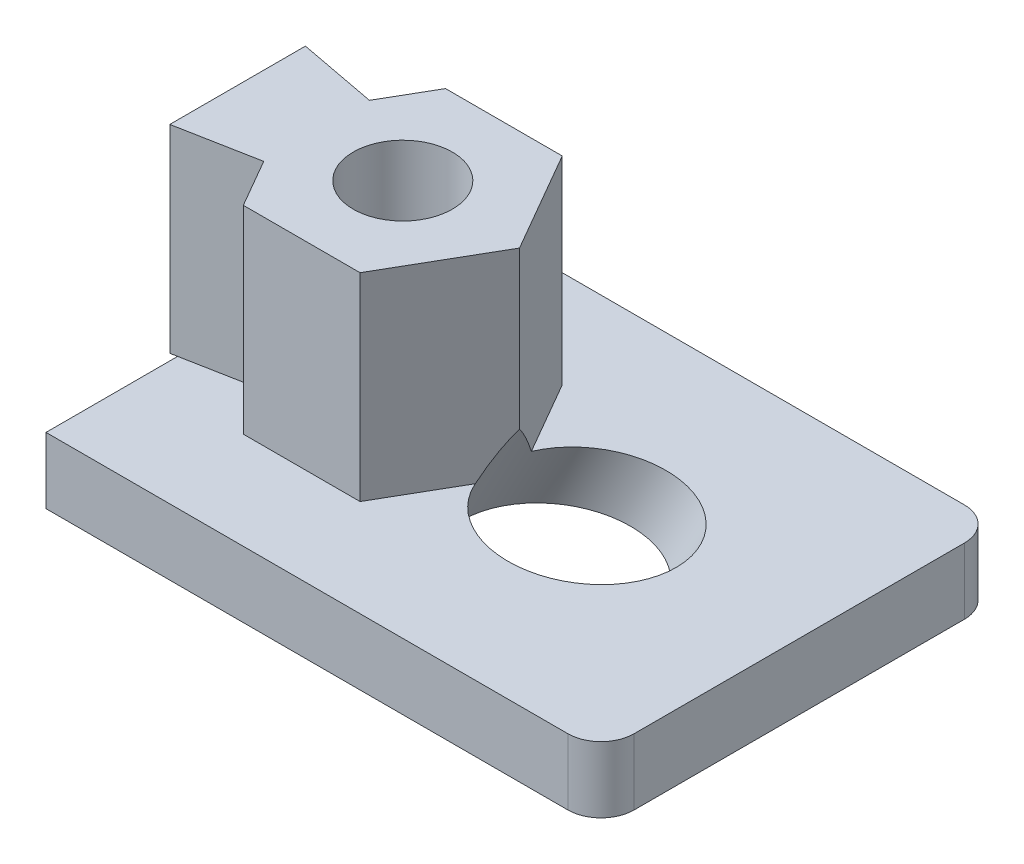
ISO-10303-21;
HEADER;
FILE_DESCRIPTION(('STEP AP214'),'2;1');
FILE_NAME('part.step','',(''),(''),'','','');
FILE_SCHEMA(('AUTOMOTIVE_DESIGN { 1 0 10303 214 1 1 1 1 }'));
ENDSEC;
DATA;
#1=APPLICATION_CONTEXT('core data for automotive mechanical design processes');
#2=APPLICATION_PROTOCOL_DEFINITION('international standard','automotive_design',2000,#1);
#3=PRODUCT_CONTEXT('',#1,'mechanical');
#4=PRODUCT('Part','Part','',(#3));
#5=PRODUCT_RELATED_PRODUCT_CATEGORY('part','',(#4));
#6=PRODUCT_DEFINITION_FORMATION('','',#4);
#7=PRODUCT_DEFINITION_CONTEXT('part definition',#1,'design');
#8=PRODUCT_DEFINITION('design','',#6,#7);
#9=PRODUCT_DEFINITION_SHAPE('','',#8);
#10=(LENGTH_UNIT() NAMED_UNIT(*) SI_UNIT(.MILLI.,.METRE.));
#11=(NAMED_UNIT(*) PLANE_ANGLE_UNIT() SI_UNIT($,.RADIAN.));
#12=(NAMED_UNIT(*) SI_UNIT($,.STERADIAN.) SOLID_ANGLE_UNIT());
#13=UNCERTAINTY_MEASURE_WITH_UNIT(LENGTH_MEASURE(1.E-05),#10,'distance_accuracy_value','');
#14=(GEOMETRIC_REPRESENTATION_CONTEXT(3) GLOBAL_UNCERTAINTY_ASSIGNED_CONTEXT((#13)) GLOBAL_UNIT_ASSIGNED_CONTEXT((#10,
#11,#12)) REPRESENTATION_CONTEXT('',''));
#15=CARTESIAN_POINT('',(0.,0.,0.));
#16=DIRECTION('',(0.,0.,1.));
#17=DIRECTION('',(1.,0.,0.));
#18=AXIS2_PLACEMENT_3D('',#15,#16,#17);
#19=CARTESIAN_POINT('',(0.,7.75,0.));
#20=DIRECTION('',(0.,1.,0.));
#21=DIRECTION('',(0.,0.,1.));
#22=AXIS2_PLACEMENT_3D('',#19,#20,#21);
#23=PLANE('',#22);
#24=DIRECTION('',(0.,0.,-1.));
#25=VECTOR('',#24,1.);
#26=CARTESIAN_POINT('',(1.3,7.75,1.50000000000229));
#27=LINE('',#26,#25);
#28=CARTESIAN_POINT('',(1.3,7.75,0.503733800944792));
#29=VERTEX_POINT('',#28);
#30=CARTESIAN_POINT('',(1.3,7.75,-0.503733800944791));
#31=VERTEX_POINT('',#30);
#32=EDGE_CURVE('E209',#29,#31,#27,.T.);
#33=ORIENTED_EDGE('',*,*,#32,.F.);
#34=DIRECTION('',(0.982526008207233,0.,-0.186125342703135));
#35=VECTOR('',#34,1.);
#36=CARTESIAN_POINT('',(1.84759419581572,7.75,0.400000000000002));
#37=LINE('',#36,#35);
#38=CARTESIAN_POINT('',(1.25,7.75,0.513205577831531));
#39=VERTEX_POINT('',#38);
#40=EDGE_CURVE('E290',#39,#29,#37,.T.);
#41=ORIENTED_EDGE('',*,*,#40,.F.);
#42=DIRECTION('',(0.,0.,1.));
#43=VECTOR('',#42,1.);
#44=CARTESIAN_POINT('',(1.25,7.75,0.513205577831531));
#45=LINE('',#44,#43);
#46=CARTESIAN_POINT('',(1.25,7.75,-0.51320557783153));
#47=VERTEX_POINT('',#46);
#48=EDGE_CURVE('E287',#47,#39,#45,.T.);
#49=ORIENTED_EDGE('',*,*,#48,.F.);
#50=DIRECTION('',(-0.982526008207232,0.,-0.18612534270314));
#51=VECTOR('',#50,1.);
#52=CARTESIAN_POINT('',(1.25,7.75,-0.51320557783153));
#53=LINE('',#52,#51);
#54=EDGE_CURVE('E284',#31,#47,#53,.T.);
#55=ORIENTED_EDGE('',*,*,#54,.F.);
#56=EDGE_LOOP('',(#33,#41,#49,#55));
#57=FACE_BOUND('',#56,.T.);
#58=ADVANCED_FACE('F33',(#57),#23,.F.);
#59=CARTESIAN_POINT('',(0.,9.25,0.));
#60=DIRECTION('',(0.,1.,0.));
#61=DIRECTION('',(0.,0.,1.));
#62=AXIS2_PLACEMENT_3D('',#59,#60,#61);
#63=PLANE('',#62);
#64=DIRECTION('',(-1.,0.,0.));
#65=VECTOR('',#64,1.);
#66=CARTESIAN_POINT('',(2.05832704406993,9.25,-0.765));
#67=LINE('',#66,#65);
#68=CARTESIAN_POINT('',(2.94167295593006,9.25,-0.764999999999997));
#69=VERTEX_POINT('',#68);
#70=CARTESIAN_POINT('',(2.05832704406993,9.25,-0.765));
#71=VERTEX_POINT('',#70);
#72=EDGE_CURVE('E175',#69,#71,#67,.T.);
#73=ORIENTED_EDGE('',*,*,#72,.T.);
#74=DIRECTION('',(-0.499999999999987,0.,0.866025403784446));
#75=VECTOR('',#74,1.);
#76=CARTESIAN_POINT('',(1.84759419581573,9.25,-0.399999999999997));
#77=LINE('',#76,#75);
#78=CARTESIAN_POINT('',(1.84759419581573,9.25,-0.399999999999997));
#79=VERTEX_POINT('',#78);
#80=EDGE_CURVE('E179',#71,#79,#77,.T.);
#81=ORIENTED_EDGE('',*,*,#80,.T.);
#82=DIRECTION('',(-0.982526008207232,0.,-0.18612534270314));
#83=VECTOR('',#82,1.);
#84=CARTESIAN_POINT('',(1.25,9.25,-0.51320557783153));
#85=LINE('',#84,#83);
#86=CARTESIAN_POINT('',(1.25,9.25,-0.51320557783153));
#87=VERTEX_POINT('',#86);
#88=EDGE_CURVE('E268',#79,#87,#85,.T.);
#89=ORIENTED_EDGE('',*,*,#88,.T.);
#90=DIRECTION('',(0.,0.,1.));
#91=VECTOR('',#90,1.);
#92=CARTESIAN_POINT('',(1.25,9.25,0.513205577831531));
#93=LINE('',#92,#91);
#94=CARTESIAN_POINT('',(1.25,9.25,0.513205577831531));
#95=VERTEX_POINT('',#94);
#96=EDGE_CURVE('E270',#87,#95,#93,.T.);
#97=ORIENTED_EDGE('',*,*,#96,.T.);
#98=DIRECTION('',(0.982526008207233,0.,-0.186125342703135));
#99=VECTOR('',#98,1.);
#100=CARTESIAN_POINT('',(1.84759419581572,9.25,0.400000000000002));
#101=LINE('',#100,#99);
#102=CARTESIAN_POINT('',(1.84759419581572,9.25,0.400000000000002));
#103=VERTEX_POINT('',#102);
#104=EDGE_CURVE('E272',#95,#103,#101,.T.);
#105=ORIENTED_EDGE('',*,*,#104,.T.);
#106=DIRECTION('',(0.500000000000006,0.,0.866025403784435));
#107=VECTOR('',#106,1.);
#108=CARTESIAN_POINT('',(2.05832704406993,9.25,0.765));
#109=LINE('',#108,#107);
#110=CARTESIAN_POINT('',(2.05832704406993,9.25,0.765));
#111=VERTEX_POINT('',#110);
#112=EDGE_CURVE('E274',#103,#111,#109,.T.);
#113=ORIENTED_EDGE('',*,*,#112,.T.);
#114=DIRECTION('',(1.,0.,0.));
#115=VECTOR('',#114,1.);
#116=CARTESIAN_POINT('',(2.94167295593006,9.25,0.765000000000002));
#117=LINE('',#116,#115);
#118=CARTESIAN_POINT('',(2.94167295593006,9.25,0.765000000000002));
#119=VERTEX_POINT('',#118);
#120=EDGE_CURVE('E276',#111,#119,#117,.T.);
#121=ORIENTED_EDGE('',*,*,#120,.T.);
#122=DIRECTION('',(0.500000000000003,0.,-0.866025403784437));
#123=VECTOR('',#122,1.);
#124=CARTESIAN_POINT('',(3.38334591186013,9.25,0.));
#125=LINE('',#124,#123);
#126=CARTESIAN_POINT('',(3.38334591186013,9.25,0.));
#127=VERTEX_POINT('',#126);
#128=EDGE_CURVE('E278',#119,#127,#125,.T.);
#129=ORIENTED_EDGE('',*,*,#128,.T.);
#130=DIRECTION('',(-0.500000000000005,0.,-0.866025403784436));
#131=VECTOR('',#130,1.);
#132=CARTESIAN_POINT('',(2.94167295593006,9.25,-0.764999999999997));
#133=LINE('',#132,#131);
#134=EDGE_CURVE('E187',#127,#69,#133,.T.);
#135=ORIENTED_EDGE('',*,*,#134,.T.);
#136=EDGE_LOOP('',(#73,#81,#89,#97,#105,#113,#121,#129,#135));
#137=FACE_BOUND('',#136,.T.);
#138=CARTESIAN_POINT('',(2.50000000000001,9.25,0.));
#139=DIRECTION('',(0.,1.,0.));
#140=DIRECTION('',(-1.,0.,0.));
#141=AXIS2_PLACEMENT_3D('',#138,#139,#140);
#142=CIRCLE('',#141,0.374999999999999);
#143=CARTESIAN_POINT('',(2.12500000000001,9.25,0.));
#144=VERTEX_POINT('',#143);
#145=EDGE_CURVE('E262',#144,#144,#142,.T.);
#146=ORIENTED_EDGE('',*,*,#145,.F.);
#147=EDGE_LOOP('',(#146));
#148=FACE_BOUND('',#147,.T.);
#149=ADVANCED_FACE('F305',(#137,#148),#63,.T.);
#150=CARTESIAN_POINT('',(2.05832704406993,9.25,-0.765));
#151=DIRECTION('',(0.,0.,1.));
#152=DIRECTION('',(1.,0.,0.));
#153=AXIS2_PLACEMENT_3D('',#150,#151,#152);
#154=PLANE('',#153);
#155=DIRECTION('',(-1.,0.,0.));
#156=VECTOR('',#155,1.);
#157=CARTESIAN_POINT('',(2.05832704406993,7.75,-0.765));
#158=LINE('',#157,#156);
#159=CARTESIAN_POINT('',(2.94167295593006,7.75,-0.764999999999997));
#160=VERTEX_POINT('',#159);
#161=CARTESIAN_POINT('',(2.05832704406993,7.75,-0.765));
#162=VERTEX_POINT('',#161);
#163=EDGE_CURVE('E174',#160,#162,#158,.T.);
#164=ORIENTED_EDGE('',*,*,#163,.T.);
#165=DIRECTION('',(0.,-1.,0.));
#166=VECTOR('',#165,1.);
#167=CARTESIAN_POINT('',(2.05832704406993,9.25,-0.765));
#168=LINE('',#167,#166);
#169=EDGE_CURVE('E207',#71,#162,#168,.T.);
#170=ORIENTED_EDGE('',*,*,#169,.F.);
#171=ORIENTED_EDGE('',*,*,#72,.F.);
#172=DIRECTION('',(0.,-1.,0.));
#173=VECTOR('',#172,1.);
#174=CARTESIAN_POINT('',(2.94167295593006,9.25,-0.764999999999997));
#175=LINE('',#174,#173);
#176=EDGE_CURVE('E185',#69,#160,#175,.T.);
#177=ORIENTED_EDGE('',*,*,#176,.T.);
#178=EDGE_LOOP('',(#164,#170,#171,#177));
#179=FACE_BOUND('',#178,.T.);
#180=ADVANCED_FACE('F359',(#179),#154,.F.);
#181=CARTESIAN_POINT('',(1.84759419581573,9.25,-0.399999999999997));
#182=DIRECTION('',(0.866025403784446,0.,0.499999999999987));
#183=DIRECTION('',(0.499999999999987,0.,-0.866025403784446));
#184=AXIS2_PLACEMENT_3D('',#181,#182,#183);
#185=PLANE('',#184);
#186=DIRECTION('',(-0.499999999999987,0.,0.866025403784446));
#187=VECTOR('',#186,1.);
#188=CARTESIAN_POINT('',(1.84759419581573,7.75,-0.399999999999997));
#189=LINE('',#188,#187);
#190=CARTESIAN_POINT('',(1.84759419581573,7.75,-0.399999999999997));
#191=VERTEX_POINT('',#190);
#192=EDGE_CURVE('E282',#162,#191,#189,.T.);
#193=ORIENTED_EDGE('',*,*,#192,.T.);
#194=DIRECTION('',(0.,-1.,0.));
#195=VECTOR('',#194,1.);
#196=CARTESIAN_POINT('',(1.84759419581573,9.25,-0.399999999999997));
#197=LINE('',#196,#195);
#198=EDGE_CURVE('E204',#79,#191,#197,.T.);
#199=ORIENTED_EDGE('',*,*,#198,.F.);
#200=ORIENTED_EDGE('',*,*,#80,.F.);
#201=ORIENTED_EDGE('',*,*,#169,.T.);
#202=EDGE_LOOP('',(#193,#199,#200,#201));
#203=FACE_BOUND('',#202,.T.);
#204=ADVANCED_FACE('F481',(#203),#185,.F.);
#205=CARTESIAN_POINT('',(1.25,9.25,-0.51320557783153));
#206=DIRECTION('',(-0.18612534270314,0.,0.982526008207232));
#207=DIRECTION('',(0.982526008207233,0.,0.18612534270314));
#208=AXIS2_PLACEMENT_3D('',#205,#206,#207);
#209=PLANE('',#208);
#210=EDGE_CURVE('E285',#191,#31,#53,.T.);
#211=ORIENTED_EDGE('',*,*,#210,.T.);
#212=ORIENTED_EDGE('',*,*,#54,.T.);
#213=DIRECTION('',(0.,-1.,0.));
#214=VECTOR('',#213,1.);
#215=CARTESIAN_POINT('',(1.25,9.25,-0.51320557783153));
#216=LINE('',#215,#214);
#217=EDGE_CURVE('E201',#87,#47,#216,.T.);
#218=ORIENTED_EDGE('',*,*,#217,.F.);
#219=ORIENTED_EDGE('',*,*,#88,.F.);
#220=ORIENTED_EDGE('',*,*,#198,.T.);
#221=EDGE_LOOP('',(#211,#212,#218,#219,#220));
#222=FACE_BOUND('',#221,.T.);
#223=ADVANCED_FACE('F334',(#222),#209,.F.);
#224=CARTESIAN_POINT('',(1.25,9.25,0.513205577831531));
#225=DIRECTION('',(1.,0.,0.));
#226=DIRECTION('',(0.,0.,-1.));
#227=AXIS2_PLACEMENT_3D('',#224,#225,#226);
#228=PLANE('',#227);
#229=ORIENTED_EDGE('',*,*,#48,.T.);
#230=DIRECTION('',(0.,-1.,0.));
#231=VECTOR('',#230,1.);
#232=CARTESIAN_POINT('',(1.25,9.25,0.513205577831531));
#233=LINE('',#232,#231);
#234=EDGE_CURVE('E198',#95,#39,#233,.T.);
#235=ORIENTED_EDGE('',*,*,#234,.F.);
#236=ORIENTED_EDGE('',*,*,#96,.F.);
#237=ORIENTED_EDGE('',*,*,#217,.T.);
#238=EDGE_LOOP('',(#229,#235,#236,#237));
#239=FACE_BOUND('',#238,.T.);
#240=ADVANCED_FACE('F343',(#239),#228,.F.);
#241=CARTESIAN_POINT('',(1.84759419581572,9.25,0.400000000000002));
#242=DIRECTION('',(-0.186125342703135,0.,-0.982526008207233));
#243=DIRECTION('',(-0.982526008207234,0.,0.186125342703135));
#244=AXIS2_PLACEMENT_3D('',#241,#242,#243);
#245=PLANE('',#244);
#246=ORIENTED_EDGE('',*,*,#40,.T.);
#247=CARTESIAN_POINT('',(1.84759419581572,7.75,0.400000000000002));
#248=VERTEX_POINT('',#247);
#249=EDGE_CURVE('E289',#29,#248,#37,.T.);
#250=ORIENTED_EDGE('',*,*,#249,.T.);
#251=DIRECTION('',(0.,-1.,0.));
#252=VECTOR('',#251,1.);
#253=CARTESIAN_POINT('',(1.84759419581572,9.25,0.400000000000002));
#254=LINE('',#253,#252);
#255=EDGE_CURVE('E195',#103,#248,#254,.T.);
#256=ORIENTED_EDGE('',*,*,#255,.F.);
#257=ORIENTED_EDGE('',*,*,#104,.F.);
#258=ORIENTED_EDGE('',*,*,#234,.T.);
#259=EDGE_LOOP('',(#246,#250,#256,#257,#258));
#260=FACE_BOUND('',#259,.T.);
#261=ADVANCED_FACE('F345',(#260),#245,.F.);
#262=CARTESIAN_POINT('',(2.05832704406993,9.25,0.765));
#263=DIRECTION('',(0.866025403784435,0.,-0.500000000000006));
#264=DIRECTION('',(-0.500000000000006,0.,-0.866025403784435));
#265=AXIS2_PLACEMENT_3D('',#262,#263,#264);
#266=PLANE('',#265);
#267=DIRECTION('',(0.500000000000006,0.,0.866025403784435));
#268=VECTOR('',#267,1.);
#269=CARTESIAN_POINT('',(2.05832704406993,7.75,0.765));
#270=LINE('',#269,#268);
#271=CARTESIAN_POINT('',(2.05832704406993,7.75,0.765));
#272=VERTEX_POINT('',#271);
#273=EDGE_CURVE('E293',#248,#272,#270,.T.);
#274=ORIENTED_EDGE('',*,*,#273,.T.);
#275=DIRECTION('',(0.,-1.,0.));
#276=VECTOR('',#275,1.);
#277=CARTESIAN_POINT('',(2.05832704406993,9.25,0.765));
#278=LINE('',#277,#276);
#279=EDGE_CURVE('E192',#111,#272,#278,.T.);
#280=ORIENTED_EDGE('',*,*,#279,.F.);
#281=ORIENTED_EDGE('',*,*,#112,.F.);
#282=ORIENTED_EDGE('',*,*,#255,.T.);
#283=EDGE_LOOP('',(#274,#280,#281,#282));
#284=FACE_BOUND('',#283,.T.);
#285=ADVANCED_FACE('F311',(#284),#266,.F.);
#286=CARTESIAN_POINT('',(2.94167295593006,9.25,0.765000000000002));
#287=DIRECTION('',(0.,0.,-1.));
#288=DIRECTION('',(-1.,0.,0.));
#289=AXIS2_PLACEMENT_3D('',#286,#287,#288);
#290=PLANE('',#289);
#291=DIRECTION('',(1.,0.,0.));
#292=VECTOR('',#291,1.);
#293=CARTESIAN_POINT('',(2.94167295593006,7.75,0.765000000000002));
#294=LINE('',#293,#292);
#295=CARTESIAN_POINT('',(2.94167295593006,7.75,0.765000000000002));
#296=VERTEX_POINT('',#295);
#297=EDGE_CURVE('E181',#272,#296,#294,.T.);
#298=ORIENTED_EDGE('',*,*,#297,.T.);
#299=DIRECTION('',(0.,-1.,0.));
#300=VECTOR('',#299,1.);
#301=CARTESIAN_POINT('',(2.94167295593006,9.25,0.765000000000002));
#302=LINE('',#301,#300);
#303=EDGE_CURVE('E189',#119,#296,#302,.T.);
#304=ORIENTED_EDGE('',*,*,#303,.F.);
#305=ORIENTED_EDGE('',*,*,#120,.F.);
#306=ORIENTED_EDGE('',*,*,#279,.T.);
#307=EDGE_LOOP('',(#298,#304,#305,#306));
#308=FACE_BOUND('',#307,.T.);
#309=ADVANCED_FACE('F297',(#308),#290,.F.);
#310=CARTESIAN_POINT('',(3.38334591186013,9.25,0.));
#311=DIRECTION('',(-0.866025403784437,0.,-0.500000000000003));
#312=DIRECTION('',(-0.500000000000003,0.,0.866025403784437));
#313=AXIS2_PLACEMENT_3D('',#310,#311,#312);
#314=PLANE('',#313);
#315=DIRECTION('',(0.500000000000003,0.,-0.866025403784437));
#316=VECTOR('',#315,1.);
#317=CARTESIAN_POINT('',(3.38334591186013,7.75,0.));
#318=LINE('',#317,#316);
#319=CARTESIAN_POINT('',(3.26095014904517,7.75,0.211995679826664));
#320=VERTEX_POINT('',#319);
#321=EDGE_CURVE('E176',#296,#320,#318,.T.);
#322=ORIENTED_EDGE('',*,*,#321,.T.);
#323=CARTESIAN_POINT('',(3.38334591189427,6.79377358483847,-5.91256302810969E-11));
#324=DIRECTION('',(-0.866025403784437,0.,-0.500000000000003));
#325=DIRECTION('',(0.128831325280167,0.966234939601246,-0.223142400991681));
#326=AXIS2_PLACEMENT_3D('',#323,#324,#325);
#327=ELLIPSE('',#326,1.46463659655629,0.596899999967116);
#328=CARTESIAN_POINT('',(3.38334591186013,8.06218608470459,0.));
#329=VERTEX_POINT('',#328);
#330=EDGE_CURVE('E49',#320,#329,#327,.T.);
#331=ORIENTED_EDGE('',*,*,#330,.T.);
#332=DIRECTION('',(0.,-1.,0.));
#333=VECTOR('',#332,1.);
#334=CARTESIAN_POINT('',(3.38334591186013,9.25,0.));
#335=LINE('',#334,#333);
#336=EDGE_CURVE('E168',#127,#329,#335,.T.);
#337=ORIENTED_EDGE('',*,*,#336,.F.);
#338=ORIENTED_EDGE('',*,*,#128,.F.);
#339=ORIENTED_EDGE('',*,*,#303,.T.);
#340=EDGE_LOOP('',(#322,#331,#337,#338,#339));
#341=FACE_BOUND('',#340,.T.);
#342=ADVANCED_FACE('F303',(#341),#314,.F.);
#343=CARTESIAN_POINT('',(2.94167295593006,9.25,-0.764999999999997));
#344=DIRECTION('',(-0.866025403784436,0.,0.500000000000005));
#345=DIRECTION('',(0.500000000000005,0.,0.866025403784436));
#346=AXIS2_PLACEMENT_3D('',#343,#344,#345);
#347=PLANE('',#346);
#348=ORIENTED_EDGE('',*,*,#336,.T.);
#349=CARTESIAN_POINT('',(3.38334591182599,6.79377358471046,-5.91256302810969E-11));
#350=DIRECTION('',(-0.866025403784436,0.,0.500000000000005));
#351=DIRECTION('',(0.128831325280168,0.966234939601246,0.223142400991681));
#352=AXIS2_PLACEMENT_3D('',#349,#350,#351);
#353=ELLIPSE('',#352,1.46463659655629,0.596899999967116);
#354=CARTESIAN_POINT('',(3.260950149016,7.75,-0.211995679877181));
#355=VERTEX_POINT('',#354);
#356=EDGE_CURVE('E154',#329,#355,#353,.T.);
#357=ORIENTED_EDGE('',*,*,#356,.T.);
#358=DIRECTION('',(-0.500000000000005,0.,-0.866025403784436));
#359=VECTOR('',#358,1.);
#360=CARTESIAN_POINT('',(2.94167295593006,7.75,-0.764999999999997));
#361=LINE('',#360,#359);
#362=EDGE_CURVE('E164',#355,#160,#361,.T.);
#363=ORIENTED_EDGE('',*,*,#362,.T.);
#364=ORIENTED_EDGE('',*,*,#176,.F.);
#365=ORIENTED_EDGE('',*,*,#134,.F.);
#366=EDGE_LOOP('',(#348,#357,#363,#364,#365));
#367=FACE_BOUND('',#366,.T.);
#368=ADVANCED_FACE('F162',(#367),#347,.F.);
#369=CARTESIAN_POINT('',(2.50000000000001,9.25,0.));
#370=DIRECTION('',(0.,-1.,0.));
#371=DIRECTION('',(1.,0.,0.));
#372=AXIS2_PLACEMENT_3D('',#369,#370,#371);
#373=CYLINDRICAL_SURFACE('',#372,0.374999999999999);
#374=ORIENTED_EDGE('',*,*,#145,.T.);
#375=EDGE_LOOP('',(#374));
#376=FACE_BOUND('',#375,.T.);
#377=CARTESIAN_POINT('',(2.50000000000001,7.75,0.));
#378=DIRECTION('',(0.,1.,0.));
#379=DIRECTION('',(-1.,0.,0.));
#380=AXIS2_PLACEMENT_3D('',#377,#378,#379);
#381=CIRCLE('',#380,0.374999999999999);
#382=CARTESIAN_POINT('',(2.12500000000001,7.75,0.));
#383=VERTEX_POINT('',#382);
#384=EDGE_CURVE('E261',#383,#383,#381,.T.);
#385=ORIENTED_EDGE('',*,*,#384,.F.);
#386=EDGE_LOOP('',(#385));
#387=FACE_BOUND('',#386,.T.);
#388=ADVANCED_FACE('F365',(#376,#387),#373,.F.);
#389=CARTESIAN_POINT('',(0.,7.75,0.));
#390=DIRECTION('',(0.,-1.,0.));
#391=DIRECTION('',(1.,0.,0.));
#392=AXIS2_PLACEMENT_3D('',#389,#390,#391);
#393=PLANE('',#392);
#394=ORIENTED_EDGE('',*,*,#362,.F.);
#395=CARTESIAN_POINT('',(3.89333333331375,7.75,-5.91256302810969E-11));
#396=DIRECTION('',(0.,-1.,0.));
#397=DIRECTION('',(1.,0.,0.));
#398=AXIS2_PLACEMENT_3D('',#395,#396,#397);
#399=ELLIPSE('',#398,0.676486666629397,0.596899999967116);
#400=EDGE_CURVE('E151',#355,#320,#399,.T.);
#401=ORIENTED_EDGE('',*,*,#400,.T.);
#402=ORIENTED_EDGE('',*,*,#321,.F.);
#403=ORIENTED_EDGE('',*,*,#297,.F.);
#404=ORIENTED_EDGE('',*,*,#273,.F.);
#405=ORIENTED_EDGE('',*,*,#249,.F.);
#406=CARTESIAN_POINT('',(1.3,7.75,1.50000000000229));
#407=VERTEX_POINT('',#406);
#408=EDGE_CURVE('E250',#407,#29,#27,.T.);
#409=ORIENTED_EDGE('',*,*,#408,.F.);
#410=DIRECTION('',(-1.,0.,0.));
#411=VECTOR('',#410,1.);
#412=CARTESIAN_POINT('',(5.49999999994378,7.75,1.50000000000229));
#413=LINE('',#412,#411);
#414=CARTESIAN_POINT('',(5.24999999994378,7.75,1.50000000000229));
#415=VERTEX_POINT('',#414);
#416=EDGE_CURVE('E325',#415,#407,#413,.T.);
#417=ORIENTED_EDGE('',*,*,#416,.F.);
#418=CARTESIAN_POINT('',(5.24999999994378,7.75,1.25000000000229));
#419=DIRECTION('',(0.,-1.,0.));
#420=DIRECTION('',(1.,0.,0.));
#421=AXIS2_PLACEMENT_3D('',#418,#419,#420);
#422=CIRCLE('',#421,0.25);
#423=CARTESIAN_POINT('',(5.49999999994378,7.75,1.25000000000229));
#424=VERTEX_POINT('',#423);
#425=EDGE_CURVE('E215',#415,#424,#422,.F.);
#426=ORIENTED_EDGE('',*,*,#425,.T.);
#427=DIRECTION('',(0.,0.,1.));
#428=VECTOR('',#427,1.);
#429=CARTESIAN_POINT('',(5.49999999994378,7.75,1.50000000000229));
#430=LINE('',#429,#428);
#431=CARTESIAN_POINT('',(5.49999999994378,7.75,-1.24999999999549));
#432=VERTEX_POINT('',#431);
#433=EDGE_CURVE('E244',#432,#424,#430,.T.);
#434=ORIENTED_EDGE('',*,*,#433,.F.);
#435=CARTESIAN_POINT('',(5.24999999994378,7.75,-1.24999999999549));
#436=DIRECTION('',(0.,-1.,0.));
#437=DIRECTION('',(1.,0.,0.));
#438=AXIS2_PLACEMENT_3D('',#435,#436,#437);
#439=CIRCLE('',#438,0.25);
#440=CARTESIAN_POINT('',(5.24999999994378,7.75,-1.49999999999549));
#441=VERTEX_POINT('',#440);
#442=EDGE_CURVE('E217',#432,#441,#439,.F.);
#443=ORIENTED_EDGE('',*,*,#442,.T.);
#444=DIRECTION('',(1.,0.,0.));
#445=VECTOR('',#444,1.);
#446=CARTESIAN_POINT('',(1.3,7.75,-1.49999999999549));
#447=LINE('',#446,#445);
#448=CARTESIAN_POINT('',(1.3,7.75,-1.49999999999549));
#449=VERTEX_POINT('',#448);
#450=EDGE_CURVE('E238',#449,#441,#447,.T.);
#451=ORIENTED_EDGE('',*,*,#450,.F.);
#452=EDGE_CURVE('E253',#31,#449,#27,.T.);
#453=ORIENTED_EDGE('',*,*,#452,.F.);
#454=ORIENTED_EDGE('',*,*,#210,.F.);
#455=ORIENTED_EDGE('',*,*,#192,.F.);
#456=ORIENTED_EDGE('',*,*,#163,.F.);
#457=EDGE_LOOP('',(#394,#401,#402,#403,#404,#405,#409,#417,#426,#434,#443,#451,#453,#454,#455,#456));
#458=FACE_BOUND('',#457,.T.);
#459=ADVANCED_FACE('F171',(#458),#393,.F.);
#460=CARTESIAN_POINT('',(0.,7.25,0.));
#461=DIRECTION('',(0.,-1.,0.));
#462=DIRECTION('',(1.,0.,0.));
#463=AXIS2_PLACEMENT_3D('',#460,#461,#462);
#464=PLANE('',#463);
#465=CARTESIAN_POINT('',(3.62666666664708,7.25,-5.91256302810969E-11));
#466=DIRECTION('',(0.,-1.,0.));
#467=DIRECTION('',(1.,0.,0.));
#468=AXIS2_PLACEMENT_3D('',#465,#466,#467);
#469=ELLIPSE('',#468,0.676486666629397,0.596899999967116);
#470=CARTESIAN_POINT('',(4.30315333327648,7.25,-5.91256302810969E-11));
#471=VERTEX_POINT('',#470);
#472=EDGE_CURVE('E37',#471,#471,#469,.T.);
#473=ORIENTED_EDGE('',*,*,#472,.F.);
#474=EDGE_LOOP('',(#473));
#475=FACE_BOUND('',#474,.T.);
#476=DIRECTION('',(1.,0.,0.));
#477=VECTOR('',#476,1.);
#478=CARTESIAN_POINT('',(1.3,7.25,-1.49999999999549));
#479=LINE('',#478,#477);
#480=CARTESIAN_POINT('',(1.3,7.25,-1.49999999999549));
#481=VERTEX_POINT('',#480);
#482=CARTESIAN_POINT('',(5.24999999994378,7.25,-1.49999999999549));
#483=VERTEX_POINT('',#482);
#484=EDGE_CURVE('E228',#481,#483,#479,.T.);
#485=ORIENTED_EDGE('',*,*,#484,.T.);
#486=CARTESIAN_POINT('',(5.24999999994378,7.25,-1.24999999999549));
#487=DIRECTION('',(0.,-1.,0.));
#488=DIRECTION('',(1.,0.,0.));
#489=AXIS2_PLACEMENT_3D('',#486,#487,#488);
#490=CIRCLE('',#489,0.25);
#491=CARTESIAN_POINT('',(5.49999999994378,7.25,-1.24999999999549));
#492=VERTEX_POINT('',#491);
#493=EDGE_CURVE('E42',#483,#492,#490,.T.);
#494=ORIENTED_EDGE('',*,*,#493,.T.);
#495=DIRECTION('',(0.,0.,1.));
#496=VECTOR('',#495,1.);
#497=CARTESIAN_POINT('',(5.49999999994378,7.25,1.50000000000229));
#498=LINE('',#497,#496);
#499=CARTESIAN_POINT('',(5.49999999994378,7.25,1.25000000000229));
#500=VERTEX_POINT('',#499);
#501=EDGE_CURVE('E226',#492,#500,#498,.T.);
#502=ORIENTED_EDGE('',*,*,#501,.T.);
#503=CARTESIAN_POINT('',(5.24999999994378,7.25,1.25000000000229));
#504=DIRECTION('',(0.,-1.,0.));
#505=DIRECTION('',(1.,0.,0.));
#506=AXIS2_PLACEMENT_3D('',#503,#504,#505);
#507=CIRCLE('',#506,0.25);
#508=CARTESIAN_POINT('',(5.24999999994378,7.25,1.50000000000229));
#509=VERTEX_POINT('',#508);
#510=EDGE_CURVE('E57',#500,#509,#507,.T.);
#511=ORIENTED_EDGE('',*,*,#510,.T.);
#512=DIRECTION('',(-1.,0.,0.));
#513=VECTOR('',#512,1.);
#514=CARTESIAN_POINT('',(5.49999999994378,7.25,1.50000000000229));
#515=LINE('',#514,#513);
#516=CARTESIAN_POINT('',(1.3,7.25,1.50000000000229));
#517=VERTEX_POINT('',#516);
#518=EDGE_CURVE('E237',#509,#517,#515,.T.);
#519=ORIENTED_EDGE('',*,*,#518,.T.);
#520=DIRECTION('',(0.,0.,-1.));
#521=VECTOR('',#520,1.);
#522=CARTESIAN_POINT('',(1.3,7.25,1.50000000000229));
#523=LINE('',#522,#521);
#524=EDGE_CURVE('E321',#517,#481,#523,.T.);
#525=ORIENTED_EDGE('',*,*,#524,.T.);
#526=EDGE_LOOP('',(#485,#494,#502,#511,#519,#525));
#527=FACE_BOUND('',#526,.T.);
#528=ADVANCED_FACE('F225',(#475,#527),#464,.T.);
#529=CARTESIAN_POINT('',(1.3,7.25,-1.49999999999549));
#530=DIRECTION('',(0.,0.,1.));
#531=DIRECTION('',(1.,0.,0.));
#532=AXIS2_PLACEMENT_3D('',#529,#530,#531);
#533=PLANE('',#532);
#534=ORIENTED_EDGE('',*,*,#450,.T.);
#535=DIRECTION('',(0.,1.,0.));
#536=VECTOR('',#535,1.);
#537=CARTESIAN_POINT('',(5.24999999994378,7.25,-1.49999999999549));
#538=LINE('',#537,#536);
#539=EDGE_CURVE('E219',#441,#483,#538,.F.);
#540=ORIENTED_EDGE('',*,*,#539,.T.);
#541=ORIENTED_EDGE('',*,*,#484,.F.);
#542=DIRECTION('',(0.,1.,0.));
#543=VECTOR('',#542,1.);
#544=CARTESIAN_POINT('',(1.3,7.25,-1.49999999999549));
#545=LINE('',#544,#543);
#546=EDGE_CURVE('E249',#481,#449,#545,.T.);
#547=ORIENTED_EDGE('',*,*,#546,.T.);
#548=EDGE_LOOP('',(#534,#540,#541,#547));
#549=FACE_BOUND('',#548,.T.);
#550=ADVANCED_FACE('F247',(#549),#533,.F.);
#551=CARTESIAN_POINT('',(1.3,7.25,1.50000000000229));
#552=DIRECTION('',(1.,0.,0.));
#553=DIRECTION('',(0.,1.,0.));
#554=AXIS2_PLACEMENT_3D('',#551,#552,#553);
#555=PLANE('',#554);
#556=ORIENTED_EDGE('',*,*,#408,.T.);
#557=ORIENTED_EDGE('',*,*,#32,.T.);
#558=ORIENTED_EDGE('',*,*,#452,.T.);
#559=ORIENTED_EDGE('',*,*,#546,.F.);
#560=ORIENTED_EDGE('',*,*,#524,.F.);
#561=DIRECTION('',(0.,1.,0.));
#562=VECTOR('',#561,1.);
#563=CARTESIAN_POINT('',(1.3,7.25,1.50000000000229));
#564=LINE('',#563,#562);
#565=EDGE_CURVE('E258',#517,#407,#564,.T.);
#566=ORIENTED_EDGE('',*,*,#565,.T.);
#567=EDGE_LOOP('',(#556,#557,#558,#559,#560,#566));
#568=FACE_BOUND('',#567,.T.);
#569=ADVANCED_FACE('F318',(#568),#555,.F.);
#570=CARTESIAN_POINT('',(5.49999999994378,7.25,1.50000000000229));
#571=DIRECTION('',(0.,0.,-1.));
#572=DIRECTION('',(-1.,0.,0.));
#573=AXIS2_PLACEMENT_3D('',#570,#571,#572);
#574=PLANE('',#573);
#575=ORIENTED_EDGE('',*,*,#518,.F.);
#576=DIRECTION('',(0.,1.,0.));
#577=VECTOR('',#576,1.);
#578=CARTESIAN_POINT('',(5.24999999994378,7.25,1.50000000000229));
#579=LINE('',#578,#577);
#580=EDGE_CURVE('E11',#509,#415,#579,.T.);
#581=ORIENTED_EDGE('',*,*,#580,.T.);
#582=ORIENTED_EDGE('',*,*,#416,.T.);
#583=ORIENTED_EDGE('',*,*,#565,.F.);
#584=EDGE_LOOP('',(#575,#581,#582,#583));
#585=FACE_BOUND('',#584,.T.);
#586=ADVANCED_FACE('F323',(#585),#574,.F.);
#587=CARTESIAN_POINT('',(5.49999999994378,7.25,1.50000000000229));
#588=DIRECTION('',(-1.,0.,0.));
#589=DIRECTION('',(0.,-1.,0.));
#590=AXIS2_PLACEMENT_3D('',#587,#588,#589);
#591=PLANE('',#590);
#592=ORIENTED_EDGE('',*,*,#501,.F.);
#593=DIRECTION('',(0.,1.,0.));
#594=VECTOR('',#593,1.);
#595=CARTESIAN_POINT('',(5.49999999994378,7.25,-1.24999999999549));
#596=LINE('',#595,#594);
#597=EDGE_CURVE('E212',#492,#432,#596,.T.);
#598=ORIENTED_EDGE('',*,*,#597,.T.);
#599=ORIENTED_EDGE('',*,*,#433,.T.);
#600=DIRECTION('',(0.,1.,0.));
#601=VECTOR('',#600,1.);
#602=CARTESIAN_POINT('',(5.49999999994378,7.25,1.25000000000229));
#603=LINE('',#602,#601);
#604=EDGE_CURVE('E210',#424,#500,#603,.F.);
#605=ORIENTED_EDGE('',*,*,#604,.T.);
#606=EDGE_LOOP('',(#592,#598,#599,#605));
#607=FACE_BOUND('',#606,.T.);
#608=ADVANCED_FACE('F233',(#607),#591,.F.);
#609=ORIENTED_EDGE('',*,*,#384,.T.);
#610=EDGE_LOOP('',(#609));
#611=FACE_BOUND('',#610,.T.);
#612=ADVANCED_FACE('F398',(#611),#393,.F.);
#613=CARTESIAN_POINT('',(5.24999999994378,7.25,-1.24999999999549));
#614=DIRECTION('',(0.,1.,0.));
#615=DIRECTION('',(-1.,0.,0.));
#616=AXIS2_PLACEMENT_3D('',#613,#614,#615);
#617=CYLINDRICAL_SURFACE('',#616,0.25);
#618=ORIENTED_EDGE('',*,*,#493,.F.);
#619=ORIENTED_EDGE('',*,*,#539,.F.);
#620=ORIENTED_EDGE('',*,*,#442,.F.);
#621=ORIENTED_EDGE('',*,*,#597,.F.);
#622=EDGE_LOOP('',(#618,#619,#620,#621));
#623=FACE_BOUND('',#622,.T.);
#624=ADVANCED_FACE('F240',(#623),#617,.T.);
#625=CARTESIAN_POINT('',(5.24999999994378,7.25,1.25000000000229));
#626=DIRECTION('',(0.,1.,0.));
#627=DIRECTION('',(-1.,0.,0.));
#628=AXIS2_PLACEMENT_3D('',#625,#626,#627);
#629=CYLINDRICAL_SURFACE('',#628,0.25);
#630=ORIENTED_EDGE('',*,*,#510,.F.);
#631=ORIENTED_EDGE('',*,*,#604,.F.);
#632=ORIENTED_EDGE('',*,*,#425,.F.);
#633=ORIENTED_EDGE('',*,*,#580,.F.);
#634=EDGE_LOOP('',(#630,#631,#632,#633));
#635=FACE_BOUND('',#634,.T.);
#636=ADVANCED_FACE('F35',(#635),#629,.T.);
#637=CARTESIAN_POINT('',(0.352941176447888,1.1117647058765,-5.91256302810969E-11));
#638=DIRECTION('',(0.470588235294117,0.882352941176471,0.));
#639=DIRECTION('',(-0.882352941176471,0.470588235294117,0.));
#640=AXIS2_PLACEMENT_3D('',#637,#638,#639);
#641=CYLINDRICAL_SURFACE('',#640,0.596899999967116);
#642=ORIENTED_EDGE('',*,*,#472,.T.);
#643=EDGE_LOOP('',(#642));
#644=FACE_BOUND('',#643,.T.);
#645=ORIENTED_EDGE('',*,*,#400,.F.);
#646=ORIENTED_EDGE('',*,*,#356,.F.);
#647=ORIENTED_EDGE('',*,*,#330,.F.);
#648=EDGE_LOOP('',(#645,#646,#647));
#649=FACE_BOUND('',#648,.T.);
#650=ADVANCED_FACE('F153',(#644,#649),#641,.F.);
#651=CLOSED_SHELL('',(#58,#149,#180,#204,#223,#240,#261,#285,#309,#342,#368,#388,#459,#528,#550,
#569,#586,#608,#612,#624,#636,#650));
#652=MANIFOLD_SOLID_BREP('B2',#651);
#653=ADVANCED_BREP_SHAPE_REPRESENTATION('',(#18,#652),#14);
#654=SHAPE_DEFINITION_REPRESENTATION(#9,#653);
ENDSEC;
END-ISO-10303-21;
